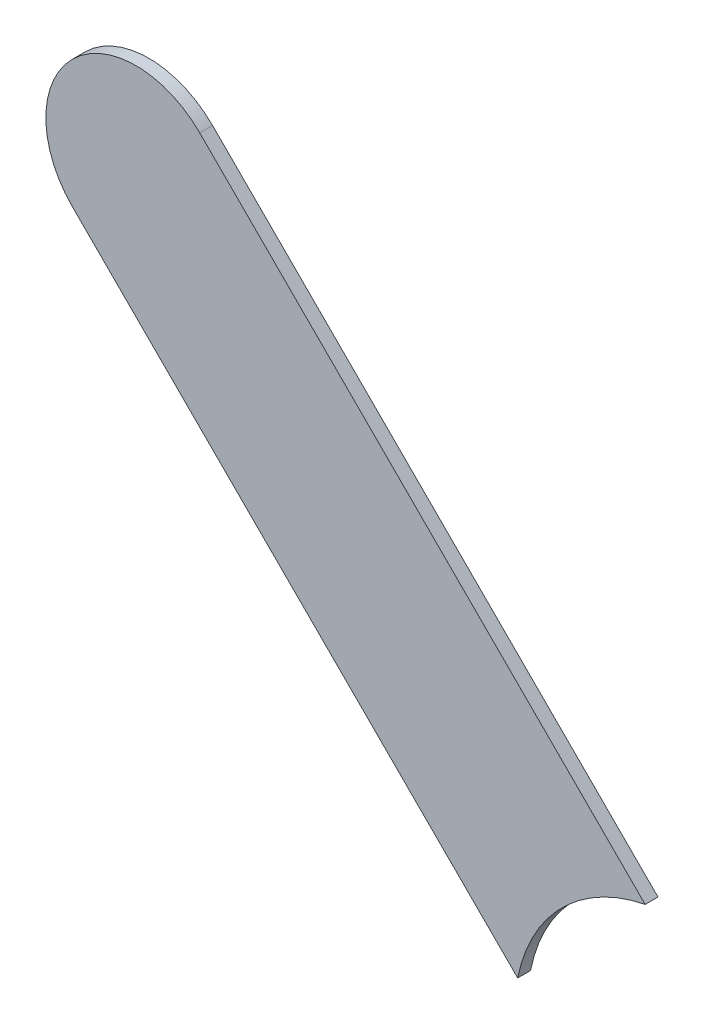
ISO-10303-21;
HEADER;
FILE_DESCRIPTION(('STEP AP214'),'2;1');
FILE_NAME('part.step','',(''),(''),'','','');
FILE_SCHEMA(('AUTOMOTIVE_DESIGN { 1 0 10303 214 1 1 1 1 }'));
ENDSEC;
DATA;
#1=APPLICATION_CONTEXT('core data for automotive mechanical design processes');
#2=APPLICATION_PROTOCOL_DEFINITION('international standard','automotive_design',2000,#1);
#3=PRODUCT_CONTEXT('',#1,'mechanical');
#4=PRODUCT('Part','Part','',(#3));
#5=PRODUCT_RELATED_PRODUCT_CATEGORY('part','',(#4));
#6=PRODUCT_DEFINITION_FORMATION('','',#4);
#7=PRODUCT_DEFINITION_CONTEXT('part definition',#1,'design');
#8=PRODUCT_DEFINITION('design','',#6,#7);
#9=PRODUCT_DEFINITION_SHAPE('','',#8);
#10=(LENGTH_UNIT() NAMED_UNIT(*) SI_UNIT(.MILLI.,.METRE.));
#11=(NAMED_UNIT(*) PLANE_ANGLE_UNIT() SI_UNIT($,.RADIAN.));
#12=(NAMED_UNIT(*) SI_UNIT($,.STERADIAN.) SOLID_ANGLE_UNIT());
#13=UNCERTAINTY_MEASURE_WITH_UNIT(LENGTH_MEASURE(1.E-05),#10,'distance_accuracy_value','');
#14=(GEOMETRIC_REPRESENTATION_CONTEXT(3) GLOBAL_UNCERTAINTY_ASSIGNED_CONTEXT((#13)) GLOBAL_UNIT_ASSIGNED_CONTEXT((#10,
#11,#12)) REPRESENTATION_CONTEXT('',''));
#15=CARTESIAN_POINT('',(0.,0.,0.));
#16=DIRECTION('',(0.,0.,1.));
#17=DIRECTION('',(1.,0.,0.));
#18=AXIS2_PLACEMENT_3D('',#15,#16,#17);
#19=CARTESIAN_POINT('',(78.22321922,84.02325842,0.));
#20=DIRECTION('',(0.707106781186544,0.707106781186551,0.));
#21=DIRECTION('',(0.707106781186551,-0.707106781186544,0.));
#22=AXIS2_PLACEMENT_3D('',#19,#20,#21);
#23=PLANE('',#22);
#24=DIRECTION('',(0.707106781186551,-0.707106781186544,0.));
#25=VECTOR('',#24,1.);
#26=CARTESIAN_POINT('',(78.22321922,84.02325842,0.03556));
#27=LINE('',#26,#25);
#28=CARTESIAN_POINT('',(78.22321922,84.02325842,0.03556));
#29=VERTEX_POINT('',#28);
#30=CARTESIAN_POINT('',(79.4586670436052,82.7878105963948,0.03556));
#31=VERTEX_POINT('',#30);
#32=EDGE_CURVE('E11',#29,#31,#27,.T.);
#33=ORIENTED_EDGE('',*,*,#32,.F.);
#34=DIRECTION('',(0.,0.,1.));
#35=VECTOR('',#34,1.);
#36=CARTESIAN_POINT('',(78.22321922,84.02325842,0.));
#37=LINE('',#36,#35);
#38=CARTESIAN_POINT('',(78.22321922,84.02325842,0.));
#39=VERTEX_POINT('',#38);
#40=EDGE_CURVE('E24',#39,#29,#37,.T.);
#41=ORIENTED_EDGE('',*,*,#40,.F.);
#42=DIRECTION('',(0.707106781186551,-0.707106781186544,0.));
#43=VECTOR('',#42,1.);
#44=CARTESIAN_POINT('',(78.22321922,84.02325842,0.));
#45=LINE('',#44,#43);
#46=CARTESIAN_POINT('',(79.4586670436052,82.7878105963948,0.));
#47=VERTEX_POINT('',#46);
#48=EDGE_CURVE('E75',#39,#47,#45,.T.);
#49=ORIENTED_EDGE('',*,*,#48,.T.);
#50=DIRECTION('',(0.,0.,1.));
#51=VECTOR('',#50,1.);
#52=CARTESIAN_POINT('',(79.4586670436052,82.7878105963948,0.));
#53=LINE('',#52,#51);
#54=EDGE_CURVE('E37',#47,#31,#53,.T.);
#55=ORIENTED_EDGE('',*,*,#54,.T.);
#56=EDGE_LOOP('',(#33,#41,#49,#55));
#57=FACE_BOUND('',#56,.T.);
#58=ADVANCED_FACE('F17',(#57),#23,.F.);
#59=CARTESIAN_POINT('',(79.900018,82.7000124,0.));
#60=DIRECTION('',(0.,0.,-1.));
#61=DIRECTION('',(1.,0.,0.));
#62=AXIS2_PLACEMENT_3D('',#59,#60,#61);
#63=CYLINDRICAL_SURFACE('',#62,0.4499991);
#64=DIRECTION('',(0.,0.,1.));
#65=VECTOR('',#64,1.);
#66=CARTESIAN_POINT('',(79.8122198036052,83.1413633563948,0.));
#67=LINE('',#66,#65);
#68=CARTESIAN_POINT('',(79.8122198036052,83.1413633563948,0.));
#69=VERTEX_POINT('',#68);
#70=CARTESIAN_POINT('',(79.8122198036052,83.1413633563948,0.03556));
#71=VERTEX_POINT('',#70);
#72=EDGE_CURVE('E67',#69,#71,#67,.T.);
#73=ORIENTED_EDGE('',*,*,#72,.T.);
#74=CARTESIAN_POINT('',(79.900018,82.7000124,0.03556));
#75=DIRECTION('',(0.,0.,1.));
#76=DIRECTION('',(1.,0.,0.));
#77=AXIS2_PLACEMENT_3D('',#74,#75,#76);
#78=CIRCLE('',#77,0.4499991);
#79=EDGE_CURVE('E82',#71,#31,#78,.T.);
#80=ORIENTED_EDGE('',*,*,#79,.T.);
#81=ORIENTED_EDGE('',*,*,#54,.F.);
#82=CARTESIAN_POINT('',(79.900018,82.7000124,0.));
#83=DIRECTION('',(0.,0.,1.));
#84=DIRECTION('',(1.,0.,0.));
#85=AXIS2_PLACEMENT_3D('',#82,#83,#84);
#86=CIRCLE('',#85,0.4499991);
#87=EDGE_CURVE('E80',#69,#47,#86,.T.);
#88=ORIENTED_EDGE('',*,*,#87,.F.);
#89=EDGE_LOOP('',(#73,#80,#81,#88));
#90=FACE_BOUND('',#89,.T.);
#91=ADVANCED_FACE('F88',(#90),#63,.F.);
#92=CARTESIAN_POINT('',(79.8122198036052,83.1413633563948,0.));
#93=DIRECTION('',(-0.707106781186548,-0.707106781186548,0.));
#94=DIRECTION('',(-0.707106781186548,0.707106781186548,0.));
#95=AXIS2_PLACEMENT_3D('',#92,#93,#94);
#96=PLANE('',#95);
#97=DIRECTION('',(-0.707106781186548,0.707106781186548,0.));
#98=VECTOR('',#97,1.);
#99=CARTESIAN_POINT('',(80.07679438,82.87678878,0.03556));
#100=LINE('',#99,#98);
#101=CARTESIAN_POINT('',(78.57677198,84.37681118,0.03556));
#102=VERTEX_POINT('',#101);
#103=EDGE_CURVE('E71',#71,#102,#100,.T.);
#104=ORIENTED_EDGE('',*,*,#103,.F.);
#105=ORIENTED_EDGE('',*,*,#72,.F.);
#106=DIRECTION('',(-0.707106781186548,0.707106781186548,0.));
#107=VECTOR('',#106,1.);
#108=CARTESIAN_POINT('',(80.07679438,82.87678878,0.));
#109=LINE('',#108,#107);
#110=CARTESIAN_POINT('',(78.57677198,84.37681118,0.));
#111=VERTEX_POINT('',#110);
#112=EDGE_CURVE('E63',#69,#111,#109,.T.);
#113=ORIENTED_EDGE('',*,*,#112,.T.);
#114=DIRECTION('',(0.,0.,1.));
#115=VECTOR('',#114,1.);
#116=CARTESIAN_POINT('',(78.57677198,84.37681118,0.));
#117=LINE('',#116,#115);
#118=EDGE_CURVE('E53',#111,#102,#117,.T.);
#119=ORIENTED_EDGE('',*,*,#118,.T.);
#120=EDGE_LOOP('',(#104,#105,#113,#119));
#121=FACE_BOUND('',#120,.T.);
#122=ADVANCED_FACE('F66',(#121),#96,.F.);
#123=CARTESIAN_POINT('',(78.3999956,84.2000348,0.));
#124=DIRECTION('',(0.,0.,-1.));
#125=DIRECTION('',(0.707106781186576,0.707106781186519,0.));
#126=AXIS2_PLACEMENT_3D('',#123,#124,#125);
#127=CYLINDRICAL_SURFACE('',#126,0.249999554103216);
#128=CARTESIAN_POINT('',(78.3999956,84.2000348,0.03556));
#129=DIRECTION('',(0.,0.,1.));
#130=DIRECTION('',(0.707106781186576,0.707106781186519,0.));
#131=AXIS2_PLACEMENT_3D('',#128,#129,#130);
#132=CIRCLE('',#131,0.249999554103216);
#133=EDGE_CURVE('E59',#102,#29,#132,.T.);
#134=ORIENTED_EDGE('',*,*,#133,.F.);
#135=ORIENTED_EDGE('',*,*,#118,.F.);
#136=CARTESIAN_POINT('',(78.3999956,84.2000348,0.));
#137=DIRECTION('',(0.,0.,1.));
#138=DIRECTION('',(0.707106781186576,0.707106781186519,0.));
#139=AXIS2_PLACEMENT_3D('',#136,#137,#138);
#140=CIRCLE('',#139,0.249999554103216);
#141=EDGE_CURVE('E57',#111,#39,#140,.T.);
#142=ORIENTED_EDGE('',*,*,#141,.T.);
#143=ORIENTED_EDGE('',*,*,#40,.T.);
#144=EDGE_LOOP('',(#134,#135,#142,#143));
#145=FACE_BOUND('',#144,.T.);
#146=ADVANCED_FACE('F55',(#145),#127,.T.);
#147=CARTESIAN_POINT('',(78.22321922,84.02325842,0.));
#148=DIRECTION('',(0.,0.,-1.));
#149=DIRECTION('',(-1.,0.,0.));
#150=AXIS2_PLACEMENT_3D('',#147,#148,#149);
#151=PLANE('',#150);
#152=ORIENTED_EDGE('',*,*,#48,.F.);
#153=ORIENTED_EDGE('',*,*,#141,.F.);
#154=ORIENTED_EDGE('',*,*,#112,.F.);
#155=ORIENTED_EDGE('',*,*,#87,.T.);
#156=EDGE_LOOP('',(#152,#153,#154,#155));
#157=FACE_BOUND('',#156,.T.);
#158=ADVANCED_FACE('F74',(#157),#151,.T.);
#159=CARTESIAN_POINT('',(78.22321922,84.02325842,0.03556));
#160=DIRECTION('',(0.,0.,-1.));
#161=DIRECTION('',(-1.,0.,0.));
#162=AXIS2_PLACEMENT_3D('',#159,#160,#161);
#163=PLANE('',#162);
#164=ORIENTED_EDGE('',*,*,#133,.T.);
#165=ORIENTED_EDGE('',*,*,#32,.T.);
#166=ORIENTED_EDGE('',*,*,#79,.F.);
#167=ORIENTED_EDGE('',*,*,#103,.T.);
#168=EDGE_LOOP('',(#164,#165,#166,#167));
#169=FACE_BOUND('',#168,.T.);
#170=ADVANCED_FACE('F91',(#169),#163,.F.);
#171=CLOSED_SHELL('',(#58,#91,#122,#146,#158,#170));
#172=MANIFOLD_SOLID_BREP('B1',#171);
#173=ADVANCED_BREP_SHAPE_REPRESENTATION('',(#18,#172),#14);
#174=SHAPE_DEFINITION_REPRESENTATION(#9,#173);
ENDSEC;
END-ISO-10303-21;
